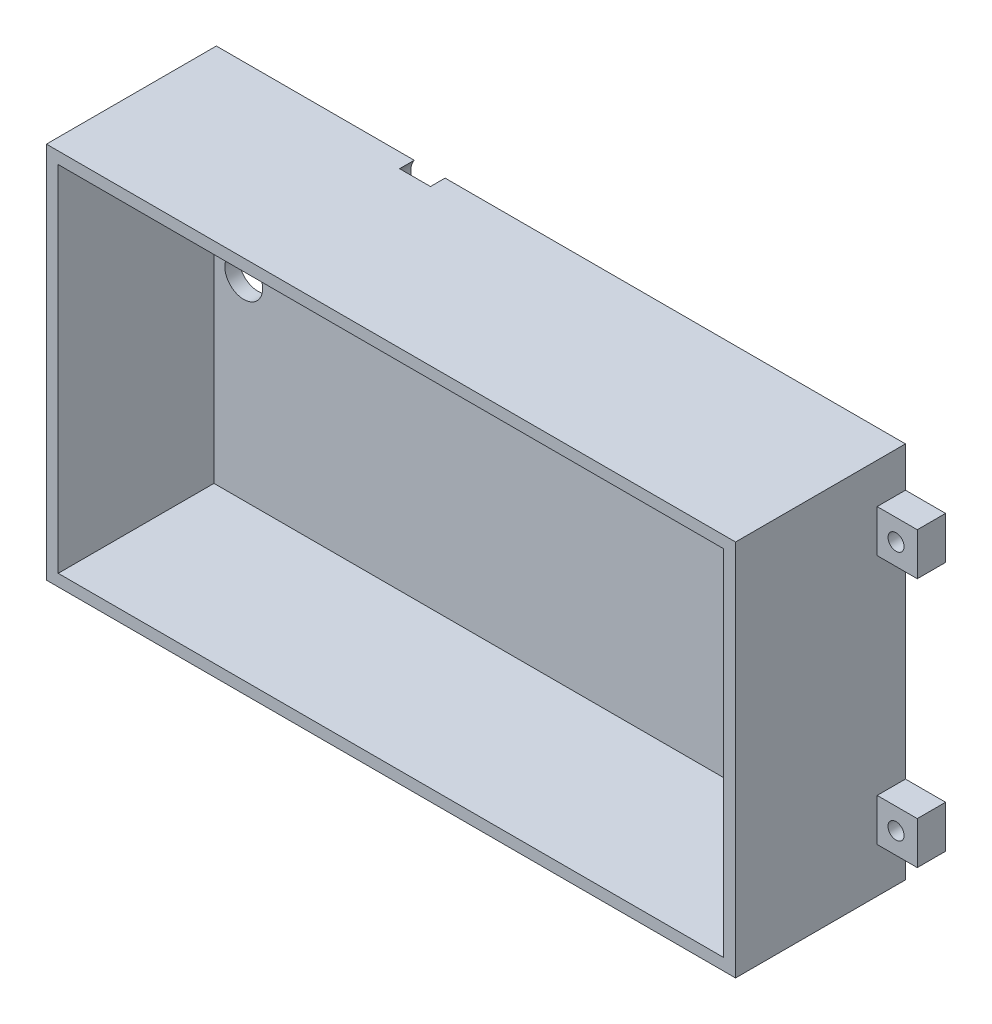
ISO-10303-21;
HEADER;
FILE_DESCRIPTION(('STEP AP214'),'2;1');
FILE_NAME('part.step','',(''),(''),'','','');
FILE_SCHEMA(('AUTOMOTIVE_DESIGN { 1 0 10303 214 1 1 1 1 }'));
ENDSEC;
DATA;
#1=APPLICATION_CONTEXT('core data for automotive mechanical design processes');
#2=APPLICATION_PROTOCOL_DEFINITION('international standard','automotive_design',2000,#1);
#3=PRODUCT_CONTEXT('',#1,'mechanical');
#4=PRODUCT('Part','Part','',(#3));
#5=PRODUCT_RELATED_PRODUCT_CATEGORY('part','',(#4));
#6=PRODUCT_DEFINITION_FORMATION('','',#4);
#7=PRODUCT_DEFINITION_CONTEXT('part definition',#1,'design');
#8=PRODUCT_DEFINITION('design','',#6,#7);
#9=PRODUCT_DEFINITION_SHAPE('','',#8);
#10=(LENGTH_UNIT() NAMED_UNIT(*) SI_UNIT(.MILLI.,.METRE.));
#11=(NAMED_UNIT(*) PLANE_ANGLE_UNIT() SI_UNIT($,.RADIAN.));
#12=(NAMED_UNIT(*) SI_UNIT($,.STERADIAN.) SOLID_ANGLE_UNIT());
#13=UNCERTAINTY_MEASURE_WITH_UNIT(LENGTH_MEASURE(1.E-05),#10,'distance_accuracy_value','');
#14=(GEOMETRIC_REPRESENTATION_CONTEXT(3) GLOBAL_UNCERTAINTY_ASSIGNED_CONTEXT((#13)) GLOBAL_UNIT_ASSIGNED_CONTEXT((#10,
#11,#12)) REPRESENTATION_CONTEXT('',''));
#15=CARTESIAN_POINT('',(0.,0.,0.));
#16=DIRECTION('',(0.,0.,1.));
#17=DIRECTION('',(1.,0.,0.));
#18=AXIS2_PLACEMENT_3D('',#15,#16,#17);
#19=CARTESIAN_POINT('',(106.75,-174.5,187.5));
#20=DIRECTION('',(0.,0.,1.));
#21=DIRECTION('',(1.,0.,0.));
#22=AXIS2_PLACEMENT_3D('',#19,#20,#21);
#23=PLANE('',#22);
#24=CARTESIAN_POINT('',(112.,-170.,187.5));
#25=DIRECTION('',(0.,0.,1.));
#26=DIRECTION('',(1.,0.,0.));
#27=AXIS2_PLACEMENT_3D('',#24,#25,#26);
#28=CIRCLE('',#27,1.7);
#29=CARTESIAN_POINT('',(113.7,-170.,187.5));
#30=VERTEX_POINT('',#29);
#31=EDGE_CURVE('E581',#30,#30,#28,.T.);
#32=ORIENTED_EDGE('',*,*,#31,.F.);
#33=EDGE_LOOP('',(#32));
#34=FACE_BOUND('',#33,.T.);
#35=DIRECTION('',(1.,0.,0.));
#36=VECTOR('',#35,1.);
#37=CARTESIAN_POINT('',(106.75,-165.5,187.5));
#38=LINE('',#37,#36);
#39=CARTESIAN_POINT('',(108.,-165.5,187.5));
#40=VERTEX_POINT('',#39);
#41=CARTESIAN_POINT('',(116.5,-165.5,187.5));
#42=VERTEX_POINT('',#41);
#43=EDGE_CURVE('E342',#40,#42,#38,.T.);
#44=ORIENTED_EDGE('',*,*,#43,.F.);
#45=DIRECTION('',(0.,-1.,0.));
#46=VECTOR('',#45,1.);
#47=CARTESIAN_POINT('',(108.,-179.25,187.5));
#48=LINE('',#47,#46);
#49=CARTESIAN_POINT('',(108.,-174.5,187.5));
#50=VERTEX_POINT('',#49);
#51=EDGE_CURVE('E457',#40,#50,#48,.T.);
#52=ORIENTED_EDGE('',*,*,#51,.T.);
#53=DIRECTION('',(1.,0.,0.));
#54=VECTOR('',#53,1.);
#55=CARTESIAN_POINT('',(106.75,-174.5,187.5));
#56=LINE('',#55,#54);
#57=CARTESIAN_POINT('',(116.5,-174.5,187.5));
#58=VERTEX_POINT('',#57);
#59=EDGE_CURVE('E351',#50,#58,#56,.T.);
#60=ORIENTED_EDGE('',*,*,#59,.T.);
#61=DIRECTION('',(0.,1.,0.));
#62=VECTOR('',#61,1.);
#63=CARTESIAN_POINT('',(116.5,-174.5,187.5));
#64=LINE('',#63,#62);
#65=EDGE_CURVE('E338',#58,#42,#64,.T.);
#66=ORIENTED_EDGE('',*,*,#65,.T.);
#67=EDGE_LOOP('',(#44,#52,#60,#66));
#68=FACE_BOUND('',#67,.T.);
#69=ADVANCED_FACE('F14',(#34,#68),#23,.T.);
#70=CARTESIAN_POINT('',(106.75,-121.5,187.5));
#71=DIRECTION('',(0.,0.,1.));
#72=DIRECTION('',(1.,0.,0.));
#73=AXIS2_PLACEMENT_3D('',#70,#71,#72);
#74=PLANE('',#73);
#75=CARTESIAN_POINT('',(112.,-117.,187.5));
#76=DIRECTION('',(0.,0.,1.));
#77=DIRECTION('',(1.,0.,0.));
#78=AXIS2_PLACEMENT_3D('',#75,#76,#77);
#79=CIRCLE('',#78,1.7);
#80=CARTESIAN_POINT('',(113.7,-117.,187.5));
#81=VERTEX_POINT('',#80);
#82=EDGE_CURVE('E332',#81,#81,#79,.T.);
#83=ORIENTED_EDGE('',*,*,#82,.F.);
#84=EDGE_LOOP('',(#83));
#85=FACE_BOUND('',#84,.T.);
#86=DIRECTION('',(1.,0.,0.));
#87=VECTOR('',#86,1.);
#88=CARTESIAN_POINT('',(106.75,-112.5,187.5));
#89=LINE('',#88,#87);
#90=CARTESIAN_POINT('',(108.,-112.5,187.5));
#91=VERTEX_POINT('',#90);
#92=CARTESIAN_POINT('',(116.5,-112.5,187.5));
#93=VERTEX_POINT('',#92);
#94=EDGE_CURVE('E281',#91,#93,#89,.T.);
#95=ORIENTED_EDGE('',*,*,#94,.F.);
#96=DIRECTION('',(0.,-1.,0.));
#97=VECTOR('',#96,1.);
#98=CARTESIAN_POINT('',(108.,-152.75,187.5));
#99=LINE('',#98,#97);
#100=CARTESIAN_POINT('',(108.,-121.5,187.5));
#101=VERTEX_POINT('',#100);
#102=EDGE_CURVE('E285',#91,#101,#99,.T.);
#103=ORIENTED_EDGE('',*,*,#102,.T.);
#104=DIRECTION('',(1.,0.,0.));
#105=VECTOR('',#104,1.);
#106=CARTESIAN_POINT('',(106.75,-121.5,187.5));
#107=LINE('',#106,#105);
#108=CARTESIAN_POINT('',(116.5,-121.5,187.5));
#109=VERTEX_POINT('',#108);
#110=EDGE_CURVE('E274',#101,#109,#107,.T.);
#111=ORIENTED_EDGE('',*,*,#110,.T.);
#112=DIRECTION('',(0.,1.,0.));
#113=VECTOR('',#112,1.);
#114=CARTESIAN_POINT('',(116.5,-121.5,187.5));
#115=LINE('',#114,#113);
#116=EDGE_CURVE('E288',#109,#93,#115,.T.);
#117=ORIENTED_EDGE('',*,*,#116,.T.);
#118=EDGE_LOOP('',(#95,#103,#111,#117));
#119=FACE_BOUND('',#118,.T.);
#120=ADVANCED_FACE('F283',(#85,#119),#74,.T.);
#121=CARTESIAN_POINT('',(-35.5,-181.5,184.5));
#122=DIRECTION('',(0.,0.,1.));
#123=DIRECTION('',(1.,0.,0.));
#124=AXIS2_PLACEMENT_3D('',#121,#122,#123);
#125=PLANE('',#124);
#126=CARTESIAN_POINT('',(-29.19341531972,-140.5927623501,184.5));
#127=DIRECTION('',(0.,0.,1.));
#128=DIRECTION('',(1.,0.,0.));
#129=AXIS2_PLACEMENT_3D('',#126,#127,#128);
#130=CIRCLE('',#129,4.);
#131=CARTESIAN_POINT('',(-25.19341531972,-140.5927623501,184.5));
#132=VERTEX_POINT('',#131);
#133=EDGE_CURVE('E439',#132,#132,#130,.T.);
#134=ORIENTED_EDGE('',*,*,#133,.F.);
#135=EDGE_LOOP('',(#134));
#136=FACE_BOUND('',#135,.T.);
#137=DIRECTION('',(1.,0.,0.));
#138=VECTOR('',#137,1.);
#139=CARTESIAN_POINT('',(-35.5,-106.5,184.5));
#140=LINE('',#139,#138);
#141=CARTESIAN_POINT('',(-35.5,-106.5,184.5));
#142=VERTEX_POINT('',#141);
#143=CARTESIAN_POINT('',(3.200133768303,-106.5,184.5));
#144=VERTEX_POINT('',#143);
#145=EDGE_CURVE('E334',#142,#144,#140,.T.);
#146=ORIENTED_EDGE('',*,*,#145,.F.);
#147=DIRECTION('',(0.,1.,0.));
#148=VECTOR('',#147,1.);
#149=CARTESIAN_POINT('',(-35.5,-181.5,184.5));
#150=LINE('',#149,#148);
#151=CARTESIAN_POINT('',(-35.5,-181.5,184.5));
#152=VERTEX_POINT('',#151);
#153=EDGE_CURVE('E9',#152,#142,#150,.T.);
#154=ORIENTED_EDGE('',*,*,#153,.F.);
#155=DIRECTION('',(1.,0.,0.));
#156=VECTOR('',#155,1.);
#157=CARTESIAN_POINT('',(-35.5,-181.5,184.5));
#158=LINE('',#157,#156);
#159=CARTESIAN_POINT('',(105.5,-181.5,184.5));
#160=VERTEX_POINT('',#159);
#161=EDGE_CURVE('E358',#152,#160,#158,.T.);
#162=ORIENTED_EDGE('',*,*,#161,.T.);
#163=DIRECTION('',(0.,1.,0.));
#164=VECTOR('',#163,1.);
#165=CARTESIAN_POINT('',(105.5,-181.5,184.5));
#166=LINE('',#165,#164);
#167=CARTESIAN_POINT('',(105.5,-106.5,184.5));
#168=VERTEX_POINT('',#167);
#169=EDGE_CURVE('E423',#160,#168,#166,.T.);
#170=ORIENTED_EDGE('',*,*,#169,.T.);
#171=DIRECTION('',(1.,0.,0.));
#172=VECTOR('',#171,1.);
#173=CARTESIAN_POINT('',(-35.5,-106.5,184.5));
#174=LINE('',#173,#172);
#175=CARTESIAN_POINT('',(11.190311357962,-106.5,184.5));
#176=VERTEX_POINT('',#175);
#177=EDGE_CURVE('E24',#176,#168,#174,.T.);
#178=ORIENTED_EDGE('',*,*,#177,.F.);
#179=CARTESIAN_POINT('',(7.195222563132,-106.3018447037,184.5));
#180=DIRECTION('',(0.,0.,1.));
#181=DIRECTION('',(1.,0.,0.));
#182=AXIS2_PLACEMENT_3D('',#179,#180,#181);
#183=CIRCLE('',#182,4.);
#184=EDGE_CURVE('E411',#144,#176,#183,.T.);
#185=ORIENTED_EDGE('',*,*,#184,.F.);
#186=EDGE_LOOP('',(#146,#154,#162,#170,#178,#185));
#187=FACE_BOUND('',#186,.T.);
#188=ADVANCED_FACE('F755',(#136,#187),#125,.T.);
#189=CARTESIAN_POINT('',(-35.5,-181.5,184.5));
#190=DIRECTION('',(1.,0.,0.));
#191=DIRECTION('',(0.,1.,0.));
#192=AXIS2_PLACEMENT_3D('',#189,#190,#191);
#193=PLANE('',#192);
#194=DIRECTION('',(0.,0.,1.));
#195=VECTOR('',#194,1.);
#196=CARTESIAN_POINT('',(-35.5,-181.5,184.5));
#197=LINE('',#196,#195);
#198=CARTESIAN_POINT('',(-35.5,-181.5,217.5));
#199=VERTEX_POINT('',#198);
#200=EDGE_CURVE('E362',#152,#199,#197,.T.);
#201=ORIENTED_EDGE('',*,*,#200,.F.);
#202=ORIENTED_EDGE('',*,*,#153,.T.);
#203=DIRECTION('',(0.,0.,1.));
#204=VECTOR('',#203,1.);
#205=CARTESIAN_POINT('',(-35.5,-106.5,184.5));
#206=LINE('',#205,#204);
#207=CARTESIAN_POINT('',(-35.5,-106.5,217.5));
#208=VERTEX_POINT('',#207);
#209=EDGE_CURVE('E337',#142,#208,#206,.T.);
#210=ORIENTED_EDGE('',*,*,#209,.T.);
#211=DIRECTION('',(0.,1.,0.));
#212=VECTOR('',#211,1.);
#213=CARTESIAN_POINT('',(-35.5,-182.75,217.5));
#214=LINE('',#213,#212);
#215=EDGE_CURVE('E428',#199,#208,#214,.T.);
#216=ORIENTED_EDGE('',*,*,#215,.F.);
#217=EDGE_LOOP('',(#201,#202,#210,#216));
#218=FACE_BOUND('',#217,.T.);
#219=ADVANCED_FACE('F790',(#218),#193,.T.);
#220=CARTESIAN_POINT('',(-35.5,-106.5,184.5));
#221=DIRECTION('',(0.,1.,0.));
#222=DIRECTION('',(1.,0.,0.));
#223=AXIS2_PLACEMENT_3D('',#220,#221,#222);
#224=PLANE('',#223);
#225=DIRECTION('',(-1.,0.,0.));
#226=VECTOR('',#225,1.);
#227=CARTESIAN_POINT('',(-36.75,-106.5,217.5));
#228=LINE('',#227,#226);
#229=CARTESIAN_POINT('',(105.5,-106.5,217.5));
#230=VERTEX_POINT('',#229);
#231=EDGE_CURVE('E432',#230,#208,#228,.T.);
#232=ORIENTED_EDGE('',*,*,#231,.T.);
#233=ORIENTED_EDGE('',*,*,#209,.F.);
#234=ORIENTED_EDGE('',*,*,#145,.T.);
#235=DIRECTION('',(0.,0.,1.));
#236=VECTOR('',#235,1.);
#237=CARTESIAN_POINT('',(3.200133768304,-106.5,181.4));
#238=LINE('',#237,#236);
#239=CARTESIAN_POINT('',(3.200133768304,-106.5,184.6));
#240=VERTEX_POINT('',#239);
#241=EDGE_CURVE('E416',#144,#240,#238,.T.);
#242=ORIENTED_EDGE('',*,*,#241,.T.);
#243=DIRECTION('',(1.,0.,0.));
#244=VECTOR('',#243,1.);
#245=CARTESIAN_POINT('',(-14.15238871843,-106.5,184.6));
#246=LINE('',#245,#244);
#247=CARTESIAN_POINT('',(11.190311357961,-106.5,184.6));
#248=VERTEX_POINT('',#247);
#249=EDGE_CURVE('E485',#240,#248,#246,.T.);
#250=ORIENTED_EDGE('',*,*,#249,.T.);
#251=DIRECTION('',(0.,0.,1.));
#252=VECTOR('',#251,1.);
#253=CARTESIAN_POINT('',(11.190311357961,-106.5,181.4));
#254=LINE('',#253,#252);
#255=EDGE_CURVE('E415',#176,#248,#254,.T.);
#256=ORIENTED_EDGE('',*,*,#255,.F.);
#257=ORIENTED_EDGE('',*,*,#177,.T.);
#258=DIRECTION('',(0.,0.,1.));
#259=VECTOR('',#258,1.);
#260=CARTESIAN_POINT('',(105.5,-106.5,184.5));
#261=LINE('',#260,#259);
#262=EDGE_CURVE('E427',#168,#230,#261,.T.);
#263=ORIENTED_EDGE('',*,*,#262,.T.);
#264=EDGE_LOOP('',(#232,#233,#234,#242,#250,#256,#257,#263));
#265=FACE_BOUND('',#264,.T.);
#266=ADVANCED_FACE('F792',(#265),#224,.F.);
#267=CARTESIAN_POINT('',(105.5,-181.5,184.5));
#268=DIRECTION('',(1.,0.,0.));
#269=DIRECTION('',(0.,1.,0.));
#270=AXIS2_PLACEMENT_3D('',#267,#268,#269);
#271=PLANE('',#270);
#272=DIRECTION('',(0.,1.,0.));
#273=VECTOR('',#272,1.);
#274=CARTESIAN_POINT('',(105.5,-182.75,217.5));
#275=LINE('',#274,#273);
#276=CARTESIAN_POINT('',(105.5,-181.5,217.5));
#277=VERTEX_POINT('',#276);
#278=EDGE_CURVE('E535',#277,#230,#275,.T.);
#279=ORIENTED_EDGE('',*,*,#278,.T.);
#280=ORIENTED_EDGE('',*,*,#262,.F.);
#281=ORIENTED_EDGE('',*,*,#169,.F.);
#282=DIRECTION('',(0.,0.,1.));
#283=VECTOR('',#282,1.);
#284=CARTESIAN_POINT('',(105.5,-181.5,184.5));
#285=LINE('',#284,#283);
#286=EDGE_CURVE('E363',#160,#277,#285,.T.);
#287=ORIENTED_EDGE('',*,*,#286,.T.);
#288=EDGE_LOOP('',(#279,#280,#281,#287));
#289=FACE_BOUND('',#288,.T.);
#290=ADVANCED_FACE('F846',(#289),#271,.F.);
#291=CARTESIAN_POINT('',(-35.5,-181.5,184.5));
#292=DIRECTION('',(0.,1.,0.));
#293=DIRECTION('',(1.,0.,0.));
#294=AXIS2_PLACEMENT_3D('',#291,#292,#293);
#295=PLANE('',#294);
#296=ORIENTED_EDGE('',*,*,#286,.F.);
#297=ORIENTED_EDGE('',*,*,#161,.F.);
#298=ORIENTED_EDGE('',*,*,#200,.T.);
#299=DIRECTION('',(-1.,0.,0.));
#300=VECTOR('',#299,1.);
#301=CARTESIAN_POINT('',(-36.75,-181.5,217.5));
#302=LINE('',#301,#300);
#303=EDGE_CURVE('E433',#277,#199,#302,.T.);
#304=ORIENTED_EDGE('',*,*,#303,.F.);
#305=EDGE_LOOP('',(#296,#297,#298,#304));
#306=FACE_BOUND('',#305,.T.);
#307=ADVANCED_FACE('F782',(#306),#295,.T.);
#308=CARTESIAN_POINT('',(112.,-117.,181.3));
#309=DIRECTION('',(0.,0.,1.));
#310=DIRECTION('',(1.,0.,0.));
#311=AXIS2_PLACEMENT_3D('',#308,#309,#310);
#312=CYLINDRICAL_SURFACE('',#311,1.7);
#313=DIRECTION('',(0.,0.,1.));
#314=VECTOR('',#313,1.);
#315=CARTESIAN_POINT('',(113.7,-117.,181.3));
#316=LINE('',#315,#314);
#317=CARTESIAN_POINT('',(113.7,-117.,181.5));
#318=VERTEX_POINT('',#317);
#319=EDGE_CURVE('E328',#318,#81,#316,.T.);
#320=ORIENTED_EDGE('',*,*,#319,.F.);
#321=CARTESIAN_POINT('',(112.,-117.,181.5));
#322=DIRECTION('',(0.,0.,1.));
#323=DIRECTION('',(1.,0.,0.));
#324=AXIS2_PLACEMENT_3D('',#321,#322,#323);
#325=CIRCLE('',#324,1.7);
#326=EDGE_CURVE('E466',#318,#318,#325,.T.);
#327=ORIENTED_EDGE('',*,*,#326,.F.);
#328=ORIENTED_EDGE('',*,*,#319,.T.);
#329=ORIENTED_EDGE('',*,*,#82,.T.);
#330=EDGE_LOOP('',(#320,#327,#328,#329));
#331=FACE_BOUND('',#330,.T.);
#332=ADVANCED_FACE('F778',(#331),#312,.F.);
#333=CARTESIAN_POINT('',(-42.,-117.,181.3));
#334=DIRECTION('',(0.,0.,1.));
#335=DIRECTION('',(1.,0.,0.));
#336=AXIS2_PLACEMENT_3D('',#333,#334,#335);
#337=CYLINDRICAL_SURFACE('',#336,1.7);
#338=DIRECTION('',(0.,0.,1.));
#339=VECTOR('',#338,1.);
#340=CARTESIAN_POINT('',(-40.3,-117.,181.3));
#341=LINE('',#340,#339);
#342=CARTESIAN_POINT('',(-40.3,-117.,181.5));
#343=VERTEX_POINT('',#342);
#344=CARTESIAN_POINT('',(-40.3,-117.,187.5));
#345=VERTEX_POINT('',#344);
#346=EDGE_CURVE('E333',#343,#345,#341,.T.);
#347=ORIENTED_EDGE('',*,*,#346,.F.);
#348=CARTESIAN_POINT('',(-42.,-117.,181.5));
#349=DIRECTION('',(0.,0.,1.));
#350=DIRECTION('',(1.,0.,0.));
#351=AXIS2_PLACEMENT_3D('',#348,#349,#350);
#352=CIRCLE('',#351,1.7);
#353=EDGE_CURVE('E471',#343,#343,#352,.T.);
#354=ORIENTED_EDGE('',*,*,#353,.F.);
#355=ORIENTED_EDGE('',*,*,#346,.T.);
#356=CARTESIAN_POINT('',(-42.,-117.,187.5));
#357=DIRECTION('',(0.,0.,1.));
#358=DIRECTION('',(1.,0.,0.));
#359=AXIS2_PLACEMENT_3D('',#356,#357,#358);
#360=CIRCLE('',#359,1.7);
#361=EDGE_CURVE('E381',#345,#345,#360,.T.);
#362=ORIENTED_EDGE('',*,*,#361,.T.);
#363=EDGE_LOOP('',(#347,#354,#355,#362));
#364=FACE_BOUND('',#363,.T.);
#365=ADVANCED_FACE('F781',(#364),#337,.F.);
#366=CARTESIAN_POINT('',(-29.19341531972,-140.5927623501,181.4));
#367=DIRECTION('',(0.,0.,1.));
#368=DIRECTION('',(1.,0.,0.));
#369=AXIS2_PLACEMENT_3D('',#366,#367,#368);
#370=CYLINDRICAL_SURFACE('',#369,4.);
#371=DIRECTION('',(0.,0.,1.));
#372=VECTOR('',#371,1.);
#373=CARTESIAN_POINT('',(-25.19341531972,-140.5927623501,181.4));
#374=LINE('',#373,#372);
#375=CARTESIAN_POINT('',(-25.19341531972,-140.5927623501,181.5));
#376=VERTEX_POINT('',#375);
#377=EDGE_CURVE('E442',#376,#132,#374,.T.);
#378=ORIENTED_EDGE('',*,*,#377,.F.);
#379=CARTESIAN_POINT('',(-29.19341531972,-140.5927623501,181.5));
#380=DIRECTION('',(0.,0.,1.));
#381=DIRECTION('',(1.,0.,0.));
#382=AXIS2_PLACEMENT_3D('',#379,#380,#381);
#383=CIRCLE('',#382,4.);
#384=EDGE_CURVE('E373',#376,#376,#383,.T.);
#385=ORIENTED_EDGE('',*,*,#384,.F.);
#386=ORIENTED_EDGE('',*,*,#377,.T.);
#387=ORIENTED_EDGE('',*,*,#133,.T.);
#388=EDGE_LOOP('',(#378,#385,#386,#387));
#389=FACE_BOUND('',#388,.T.);
#390=ADVANCED_FACE('F762',(#389),#370,.F.);
#391=CARTESIAN_POINT('',(112.,-170.,181.3));
#392=DIRECTION('',(0.,0.,1.));
#393=DIRECTION('',(1.,0.,0.));
#394=AXIS2_PLACEMENT_3D('',#391,#392,#393);
#395=CYLINDRICAL_SURFACE('',#394,1.7);
#396=DIRECTION('',(0.,0.,1.));
#397=VECTOR('',#396,1.);
#398=CARTESIAN_POINT('',(113.7,-170.,181.3));
#399=LINE('',#398,#397);
#400=CARTESIAN_POINT('',(113.7,-170.,181.5));
#401=VERTEX_POINT('',#400);
#402=EDGE_CURVE('E488',#401,#30,#399,.T.);
#403=ORIENTED_EDGE('',*,*,#402,.F.);
#404=CARTESIAN_POINT('',(112.,-170.,181.5));
#405=DIRECTION('',(0.,0.,1.));
#406=DIRECTION('',(1.,0.,0.));
#407=AXIS2_PLACEMENT_3D('',#404,#405,#406);
#408=CIRCLE('',#407,1.7);
#409=EDGE_CURVE('E369',#401,#401,#408,.T.);
#410=ORIENTED_EDGE('',*,*,#409,.F.);
#411=ORIENTED_EDGE('',*,*,#402,.T.);
#412=ORIENTED_EDGE('',*,*,#31,.T.);
#413=EDGE_LOOP('',(#403,#410,#411,#412));
#414=FACE_BOUND('',#413,.T.);
#415=ADVANCED_FACE('F788',(#414),#395,.F.);
#416=CARTESIAN_POINT('',(-42.,-171.5,181.3));
#417=DIRECTION('',(0.,0.,1.));
#418=DIRECTION('',(1.,0.,0.));
#419=AXIS2_PLACEMENT_3D('',#416,#417,#418);
#420=CYLINDRICAL_SURFACE('',#419,1.7);
#421=DIRECTION('',(0.,0.,1.));
#422=VECTOR('',#421,1.);
#423=CARTESIAN_POINT('',(-40.3,-171.5,181.3));
#424=LINE('',#423,#422);
#425=CARTESIAN_POINT('',(-40.3,-171.5,181.5));
#426=VERTEX_POINT('',#425);
#427=CARTESIAN_POINT('',(-40.3,-171.5,187.5));
#428=VERTEX_POINT('',#427);
#429=EDGE_CURVE('E292',#426,#428,#424,.T.);
#430=ORIENTED_EDGE('',*,*,#429,.F.);
#431=CARTESIAN_POINT('',(-42.,-171.5,181.5));
#432=DIRECTION('',(0.,0.,1.));
#433=DIRECTION('',(1.,0.,0.));
#434=AXIS2_PLACEMENT_3D('',#431,#432,#433);
#435=CIRCLE('',#434,1.7);
#436=EDGE_CURVE('E374',#426,#426,#435,.T.);
#437=ORIENTED_EDGE('',*,*,#436,.F.);
#438=ORIENTED_EDGE('',*,*,#429,.T.);
#439=CARTESIAN_POINT('',(-42.,-171.5,187.5));
#440=DIRECTION('',(0.,0.,1.));
#441=DIRECTION('',(1.,0.,0.));
#442=AXIS2_PLACEMENT_3D('',#439,#440,#441);
#443=CIRCLE('',#442,1.7);
#444=EDGE_CURVE('E406',#428,#428,#443,.T.);
#445=ORIENTED_EDGE('',*,*,#444,.T.);
#446=EDGE_LOOP('',(#430,#437,#438,#445));
#447=FACE_BOUND('',#446,.T.);
#448=ADVANCED_FACE('F777',(#447),#420,.F.);
#449=CARTESIAN_POINT('',(106.75,-112.5,181.5));
#450=DIRECTION('',(0.,1.,0.));
#451=DIRECTION('',(1.,0.,0.));
#452=AXIS2_PLACEMENT_3D('',#449,#450,#451);
#453=PLANE('',#452);
#454=DIRECTION('',(1.,0.,0.));
#455=VECTOR('',#454,1.);
#456=CARTESIAN_POINT('',(106.75,-112.5,181.5));
#457=LINE('',#456,#455);
#458=CARTESIAN_POINT('',(108.,-112.5,181.5));
#459=VERTEX_POINT('',#458);
#460=CARTESIAN_POINT('',(116.5,-112.5,181.5));
#461=VERTEX_POINT('',#460);
#462=EDGE_CURVE('E298',#459,#461,#457,.T.);
#463=ORIENTED_EDGE('',*,*,#462,.F.);
#464=DIRECTION('',(0.,0.,1.));
#465=VECTOR('',#464,1.);
#466=CARTESIAN_POINT('',(108.,-112.5,181.5));
#467=LINE('',#466,#465);
#468=EDGE_CURVE('E295',#459,#91,#467,.T.);
#469=ORIENTED_EDGE('',*,*,#468,.T.);
#470=ORIENTED_EDGE('',*,*,#94,.T.);
#471=DIRECTION('',(0.,0.,1.));
#472=VECTOR('',#471,1.);
#473=CARTESIAN_POINT('',(116.5,-112.5,181.5));
#474=LINE('',#473,#472);
#475=EDGE_CURVE('E321',#461,#93,#474,.T.);
#476=ORIENTED_EDGE('',*,*,#475,.F.);
#477=EDGE_LOOP('',(#463,#469,#470,#476));
#478=FACE_BOUND('',#477,.T.);
#479=ADVANCED_FACE('F296',(#478),#453,.T.);
#480=CARTESIAN_POINT('',(116.5,-121.5,181.5));
#481=DIRECTION('',(1.,0.,0.));
#482=DIRECTION('',(0.,1.,0.));
#483=AXIS2_PLACEMENT_3D('',#480,#481,#482);
#484=PLANE('',#483);
#485=DIRECTION('',(0.,0.,1.));
#486=VECTOR('',#485,1.);
#487=CARTESIAN_POINT('',(116.5,-121.5,181.5));
#488=LINE('',#487,#486);
#489=CARTESIAN_POINT('',(116.5,-121.5,181.5));
#490=VERTEX_POINT('',#489);
#491=EDGE_CURVE('E546',#490,#109,#488,.T.);
#492=ORIENTED_EDGE('',*,*,#491,.F.);
#493=DIRECTION('',(0.,1.,0.));
#494=VECTOR('',#493,1.);
#495=CARTESIAN_POINT('',(116.5,-121.5,181.5));
#496=LINE('',#495,#494);
#497=EDGE_CURVE('E364',#490,#461,#496,.T.);
#498=ORIENTED_EDGE('',*,*,#497,.T.);
#499=ORIENTED_EDGE('',*,*,#475,.T.);
#500=ORIENTED_EDGE('',*,*,#116,.F.);
#501=EDGE_LOOP('',(#492,#498,#499,#500));
#502=FACE_BOUND('',#501,.T.);
#503=ADVANCED_FACE('F745',(#502),#484,.T.);
#504=CARTESIAN_POINT('',(106.75,-121.5,181.5));
#505=DIRECTION('',(0.,1.,0.));
#506=DIRECTION('',(1.,0.,0.));
#507=AXIS2_PLACEMENT_3D('',#504,#505,#506);
#508=PLANE('',#507);
#509=ORIENTED_EDGE('',*,*,#491,.T.);
#510=ORIENTED_EDGE('',*,*,#110,.F.);
#511=DIRECTION('',(0.,0.,1.));
#512=VECTOR('',#511,1.);
#513=CARTESIAN_POINT('',(108.,-121.5,181.5));
#514=LINE('',#513,#512);
#515=CARTESIAN_POINT('',(108.,-121.5,181.5));
#516=VERTEX_POINT('',#515);
#517=EDGE_CURVE('E307',#516,#101,#514,.T.);
#518=ORIENTED_EDGE('',*,*,#517,.F.);
#519=DIRECTION('',(1.,0.,0.));
#520=VECTOR('',#519,1.);
#521=CARTESIAN_POINT('',(106.75,-121.5,181.5));
#522=LINE('',#521,#520);
#523=EDGE_CURVE('E368',#516,#490,#522,.T.);
#524=ORIENTED_EDGE('',*,*,#523,.T.);
#525=EDGE_LOOP('',(#509,#510,#518,#524));
#526=FACE_BOUND('',#525,.T.);
#527=ADVANCED_FACE('F736',(#526),#508,.F.);
#528=CARTESIAN_POINT('',(-46.5,-121.5,181.5));
#529=DIRECTION('',(1.,0.,0.));
#530=DIRECTION('',(0.,1.,0.));
#531=AXIS2_PLACEMENT_3D('',#528,#529,#530);
#532=PLANE('',#531);
#533=DIRECTION('',(0.,1.,0.));
#534=VECTOR('',#533,1.);
#535=CARTESIAN_POINT('',(-46.5,-121.5,187.5));
#536=LINE('',#535,#534);
#537=CARTESIAN_POINT('',(-46.5,-121.5,187.5));
#538=VERTEX_POINT('',#537);
#539=CARTESIAN_POINT('',(-46.5,-112.5,187.5));
#540=VERTEX_POINT('',#539);
#541=EDGE_CURVE('E502',#538,#540,#536,.T.);
#542=ORIENTED_EDGE('',*,*,#541,.T.);
#543=DIRECTION('',(0.,0.,1.));
#544=VECTOR('',#543,1.);
#545=CARTESIAN_POINT('',(-46.5,-112.5,181.5));
#546=LINE('',#545,#544);
#547=CARTESIAN_POINT('',(-46.5,-112.5,181.5));
#548=VERTEX_POINT('',#547);
#549=EDGE_CURVE('E470',#548,#540,#546,.T.);
#550=ORIENTED_EDGE('',*,*,#549,.F.);
#551=DIRECTION('',(0.,1.,0.));
#552=VECTOR('',#551,1.);
#553=CARTESIAN_POINT('',(-46.5,-121.5,181.5));
#554=LINE('',#553,#552);
#555=CARTESIAN_POINT('',(-46.5,-121.5,181.5));
#556=VERTEX_POINT('',#555);
#557=EDGE_CURVE('E318',#556,#548,#554,.T.);
#558=ORIENTED_EDGE('',*,*,#557,.F.);
#559=DIRECTION('',(0.,0.,1.));
#560=VECTOR('',#559,1.);
#561=CARTESIAN_POINT('',(-46.5,-121.5,181.5));
#562=LINE('',#561,#560);
#563=EDGE_CURVE('E385',#556,#538,#562,.T.);
#564=ORIENTED_EDGE('',*,*,#563,.T.);
#565=EDGE_LOOP('',(#542,#550,#558,#564));
#566=FACE_BOUND('',#565,.T.);
#567=ADVANCED_FACE('F730',(#566),#532,.F.);
#568=CARTESIAN_POINT('',(106.75,-165.5,181.5));
#569=DIRECTION('',(0.,1.,0.));
#570=DIRECTION('',(1.,0.,0.));
#571=AXIS2_PLACEMENT_3D('',#568,#569,#570);
#572=PLANE('',#571);
#573=DIRECTION('',(1.,0.,0.));
#574=VECTOR('',#573,1.);
#575=CARTESIAN_POINT('',(106.75,-165.5,181.5));
#576=LINE('',#575,#574);
#577=CARTESIAN_POINT('',(108.,-165.5,181.5));
#578=VERTEX_POINT('',#577);
#579=CARTESIAN_POINT('',(116.5,-165.5,181.5));
#580=VERTEX_POINT('',#579);
#581=EDGE_CURVE('E422',#578,#580,#576,.T.);
#582=ORIENTED_EDGE('',*,*,#581,.F.);
#583=DIRECTION('',(0.,0.,1.));
#584=VECTOR('',#583,1.);
#585=CARTESIAN_POINT('',(108.,-165.5,181.5));
#586=LINE('',#585,#584);
#587=EDGE_CURVE('E314',#578,#40,#586,.T.);
#588=ORIENTED_EDGE('',*,*,#587,.T.);
#589=ORIENTED_EDGE('',*,*,#43,.T.);
#590=DIRECTION('',(0.,0.,1.));
#591=VECTOR('',#590,1.);
#592=CARTESIAN_POINT('',(116.5,-165.5,181.5));
#593=LINE('',#592,#591);
#594=EDGE_CURVE('E343',#580,#42,#593,.T.);
#595=ORIENTED_EDGE('',*,*,#594,.F.);
#596=EDGE_LOOP('',(#582,#588,#589,#595));
#597=FACE_BOUND('',#596,.T.);
#598=ADVANCED_FACE('F735',(#597),#572,.T.);
#599=CARTESIAN_POINT('',(116.5,-174.5,181.5));
#600=DIRECTION('',(1.,0.,0.));
#601=DIRECTION('',(0.,1.,0.));
#602=AXIS2_PLACEMENT_3D('',#599,#600,#601);
#603=PLANE('',#602);
#604=DIRECTION('',(0.,0.,1.));
#605=VECTOR('',#604,1.);
#606=CARTESIAN_POINT('',(116.5,-174.5,181.5));
#607=LINE('',#606,#605);
#608=CARTESIAN_POINT('',(116.5,-174.5,181.5));
#609=VERTEX_POINT('',#608);
#610=EDGE_CURVE('E302',#609,#58,#607,.T.);
#611=ORIENTED_EDGE('',*,*,#610,.F.);
#612=DIRECTION('',(0.,1.,0.));
#613=VECTOR('',#612,1.);
#614=CARTESIAN_POINT('',(116.5,-174.5,181.5));
#615=LINE('',#614,#613);
#616=EDGE_CURVE('E417',#609,#580,#615,.T.);
#617=ORIENTED_EDGE('',*,*,#616,.T.);
#618=ORIENTED_EDGE('',*,*,#594,.T.);
#619=ORIENTED_EDGE('',*,*,#65,.F.);
#620=EDGE_LOOP('',(#611,#617,#618,#619));
#621=FACE_BOUND('',#620,.T.);
#622=ADVANCED_FACE('F743',(#621),#603,.T.);
#623=CARTESIAN_POINT('',(106.75,-174.5,181.5));
#624=DIRECTION('',(0.,1.,0.));
#625=DIRECTION('',(1.,0.,0.));
#626=AXIS2_PLACEMENT_3D('',#623,#624,#625);
#627=PLANE('',#626);
#628=ORIENTED_EDGE('',*,*,#610,.T.);
#629=ORIENTED_EDGE('',*,*,#59,.F.);
#630=DIRECTION('',(0.,0.,1.));
#631=VECTOR('',#630,1.);
#632=CARTESIAN_POINT('',(108.,-174.5,181.5));
#633=LINE('',#632,#631);
#634=CARTESIAN_POINT('',(108.,-174.5,181.5));
#635=VERTEX_POINT('',#634);
#636=EDGE_CURVE('E497',#635,#50,#633,.T.);
#637=ORIENTED_EDGE('',*,*,#636,.F.);
#638=DIRECTION('',(1.,0.,0.));
#639=VECTOR('',#638,1.);
#640=CARTESIAN_POINT('',(106.75,-174.5,181.5));
#641=LINE('',#640,#639);
#642=EDGE_CURVE('E421',#635,#609,#641,.T.);
#643=ORIENTED_EDGE('',*,*,#642,.T.);
#644=EDGE_LOOP('',(#628,#629,#637,#643));
#645=FACE_BOUND('',#644,.T.);
#646=ADVANCED_FACE('F856',(#645),#627,.F.);
#647=CARTESIAN_POINT('',(-46.5,-176.,181.5));
#648=DIRECTION('',(1.,0.,0.));
#649=DIRECTION('',(0.,1.,0.));
#650=AXIS2_PLACEMENT_3D('',#647,#648,#649);
#651=PLANE('',#650);
#652=DIRECTION('',(0.,1.,0.));
#653=VECTOR('',#652,1.);
#654=CARTESIAN_POINT('',(-46.5,-176.,187.5));
#655=LINE('',#654,#653);
#656=CARTESIAN_POINT('',(-46.5,-176.,187.5));
#657=VERTEX_POINT('',#656);
#658=CARTESIAN_POINT('',(-46.5,-167.,187.5));
#659=VERTEX_POINT('',#658);
#660=EDGE_CURVE('E352',#657,#659,#655,.T.);
#661=ORIENTED_EDGE('',*,*,#660,.T.);
#662=DIRECTION('',(0.,0.,1.));
#663=VECTOR('',#662,1.);
#664=CARTESIAN_POINT('',(-46.5,-167.,181.5));
#665=LINE('',#664,#663);
#666=CARTESIAN_POINT('',(-46.5,-167.,181.5));
#667=VERTEX_POINT('',#666);
#668=EDGE_CURVE('E590',#667,#659,#665,.T.);
#669=ORIENTED_EDGE('',*,*,#668,.F.);
#670=DIRECTION('',(0.,1.,0.));
#671=VECTOR('',#670,1.);
#672=CARTESIAN_POINT('',(-46.5,-176.,181.5));
#673=LINE('',#672,#671);
#674=CARTESIAN_POINT('',(-46.5,-176.,181.5));
#675=VERTEX_POINT('',#674);
#676=EDGE_CURVE('E395',#675,#667,#673,.T.);
#677=ORIENTED_EDGE('',*,*,#676,.F.);
#678=DIRECTION('',(0.,0.,1.));
#679=VECTOR('',#678,1.);
#680=CARTESIAN_POINT('',(-46.5,-176.,181.5));
#681=LINE('',#680,#679);
#682=EDGE_CURVE('E410',#675,#657,#681,.T.);
#683=ORIENTED_EDGE('',*,*,#682,.T.);
#684=EDGE_LOOP('',(#661,#669,#677,#683));
#685=FACE_BOUND('',#684,.T.);
#686=ADVANCED_FACE('F858',(#685),#651,.F.);
#687=CARTESIAN_POINT('',(108.,-184.,181.5));
#688=DIRECTION('',(1.,0.,0.));
#689=DIRECTION('',(0.,1.,0.));
#690=AXIS2_PLACEMENT_3D('',#687,#688,#689);
#691=PLANE('',#690);
#692=DIRECTION('',(0.,0.,1.));
#693=VECTOR('',#692,1.);
#694=CARTESIAN_POINT('',(108.,-104.,181.5));
#695=LINE('',#694,#693);
#696=CARTESIAN_POINT('',(108.,-104.,181.5));
#697=VERTEX_POINT('',#696);
#698=CARTESIAN_POINT('',(108.,-104.,217.5));
#699=VERTEX_POINT('',#698);
#700=EDGE_CURVE('E512',#697,#699,#695,.T.);
#701=ORIENTED_EDGE('',*,*,#700,.T.);
#702=DIRECTION('',(0.,1.,0.));
#703=VECTOR('',#702,1.);
#704=CARTESIAN_POINT('',(108.,-184.,217.5));
#705=LINE('',#704,#703);
#706=CARTESIAN_POINT('',(108.,-184.,217.5));
#707=VERTEX_POINT('',#706);
#708=EDGE_CURVE('E379',#707,#699,#705,.T.);
#709=ORIENTED_EDGE('',*,*,#708,.F.);
#710=DIRECTION('',(0.,0.,1.));
#711=VECTOR('',#710,1.);
#712=CARTESIAN_POINT('',(108.,-184.,181.5));
#713=LINE('',#712,#711);
#714=CARTESIAN_POINT('',(108.,-184.,181.5));
#715=VERTEX_POINT('',#714);
#716=EDGE_CURVE('E380',#715,#707,#713,.T.);
#717=ORIENTED_EDGE('',*,*,#716,.F.);
#718=DIRECTION('',(0.,1.,0.));
#719=VECTOR('',#718,1.);
#720=CARTESIAN_POINT('',(108.,-184.,181.5));
#721=LINE('',#720,#719);
#722=EDGE_CURVE('E438',#715,#635,#721,.T.);
#723=ORIENTED_EDGE('',*,*,#722,.T.);
#724=ORIENTED_EDGE('',*,*,#636,.T.);
#725=ORIENTED_EDGE('',*,*,#51,.F.);
#726=ORIENTED_EDGE('',*,*,#587,.F.);
#727=DIRECTION('',(0.,1.,0.));
#728=VECTOR('',#727,1.);
#729=CARTESIAN_POINT('',(108.,-184.,181.5));
#730=LINE('',#729,#728);
#731=EDGE_CURVE('E492',#578,#516,#730,.T.);
#732=ORIENTED_EDGE('',*,*,#731,.T.);
#733=ORIENTED_EDGE('',*,*,#517,.T.);
#734=ORIENTED_EDGE('',*,*,#102,.F.);
#735=ORIENTED_EDGE('',*,*,#468,.F.);
#736=DIRECTION('',(0.,1.,0.));
#737=VECTOR('',#736,1.);
#738=CARTESIAN_POINT('',(108.,-184.,181.5));
#739=LINE('',#738,#737);
#740=EDGE_CURVE('E449',#459,#697,#739,.T.);
#741=ORIENTED_EDGE('',*,*,#740,.T.);
#742=EDGE_LOOP('',(#701,#709,#717,#723,#724,#725,#726,#732,#733,#734,#735,#741));
#743=FACE_BOUND('',#742,.T.);
#744=ADVANCED_FACE('F305',(#743),#691,.T.);
#745=CARTESIAN_POINT('',(7.195222563132,-106.3018447037,184.6));
#746=DIRECTION('',(0.,0.,1.));
#747=DIRECTION('',(1.,0.,0.));
#748=AXIS2_PLACEMENT_3D('',#745,#746,#747);
#749=PLANE('',#748);
#750=ORIENTED_EDGE('',*,*,#249,.F.);
#751=CARTESIAN_POINT('',(7.195222563132,-106.3018447037,184.6));
#752=DIRECTION('',(0.,0.,1.));
#753=DIRECTION('',(1.,0.,0.));
#754=AXIS2_PLACEMENT_3D('',#751,#752,#753);
#755=CIRCLE('',#754,4.);
#756=CARTESIAN_POINT('',(3.923906167574,-104.,184.6));
#757=VERTEX_POINT('',#756);
#758=EDGE_CURVE('E531',#757,#240,#755,.T.);
#759=ORIENTED_EDGE('',*,*,#758,.F.);
#760=DIRECTION('',(1.,0.,0.));
#761=VECTOR('',#760,1.);
#762=CARTESIAN_POINT('',(-15.40238871843,-104.,184.6));
#763=LINE('',#762,#761);
#764=CARTESIAN_POINT('',(10.466538958691,-104.,184.6));
#765=VERTEX_POINT('',#764);
#766=EDGE_CURVE('E476',#757,#765,#763,.T.);
#767=ORIENTED_EDGE('',*,*,#766,.T.);
#768=CARTESIAN_POINT('',(7.195222563132,-106.3018447037,184.6));
#769=DIRECTION('',(0.,0.,1.));
#770=DIRECTION('',(0.998772198707162,-0.0495388240641681,0.));
#771=AXIS2_PLACEMENT_3D('',#768,#769,#770);
#772=CIRCLE('',#771,4.);
#773=EDGE_CURVE('E461',#248,#765,#772,.T.);
#774=ORIENTED_EDGE('',*,*,#773,.F.);
#775=EDGE_LOOP('',(#750,#759,#767,#774));
#776=FACE_BOUND('',#775,.T.);
#777=ADVANCED_FACE('F674',(#776),#749,.F.);
#778=CARTESIAN_POINT('',(7.195222563132,-106.3018447037,181.4));
#779=DIRECTION('',(0.,0.,1.));
#780=DIRECTION('',(1.,0.,0.));
#781=AXIS2_PLACEMENT_3D('',#778,#779,#780);
#782=CYLINDRICAL_SURFACE('',#781,4.);
#783=DIRECTION('',(0.,0.,1.));
#784=VECTOR('',#783,1.);
#785=CARTESIAN_POINT('',(3.923906167574,-104.,181.4));
#786=LINE('',#785,#784);
#787=CARTESIAN_POINT('',(3.923906167574,-104.,181.5));
#788=VERTEX_POINT('',#787);
#789=EDGE_CURVE('E518',#788,#757,#786,.T.);
#790=ORIENTED_EDGE('',*,*,#789,.T.);
#791=ORIENTED_EDGE('',*,*,#758,.T.);
#792=ORIENTED_EDGE('',*,*,#241,.F.);
#793=ORIENTED_EDGE('',*,*,#184,.T.);
#794=ORIENTED_EDGE('',*,*,#255,.T.);
#795=ORIENTED_EDGE('',*,*,#773,.T.);
#796=DIRECTION('',(0.,0.,1.));
#797=VECTOR('',#796,1.);
#798=CARTESIAN_POINT('',(10.466538958691,-104.,181.4));
#799=LINE('',#798,#797);
#800=CARTESIAN_POINT('',(10.466538958691,-104.,181.5));
#801=VERTEX_POINT('',#800);
#802=EDGE_CURVE('E472',#801,#765,#799,.T.);
#803=ORIENTED_EDGE('',*,*,#802,.F.);
#804=CARTESIAN_POINT('',(7.195222563132,-106.3018447037,181.5));
#805=DIRECTION('',(0.,0.,1.));
#806=DIRECTION('',(-0.817829098889643,0.575461175935749,0.));
#807=AXIS2_PLACEMENT_3D('',#804,#805,#806);
#808=CIRCLE('',#807,4.);
#809=EDGE_CURVE('E445',#788,#801,#808,.T.);
#810=ORIENTED_EDGE('',*,*,#809,.F.);
#811=EDGE_LOOP('',(#790,#791,#792,#793,#794,#795,#803,#810));
#812=FACE_BOUND('',#811,.T.);
#813=ADVANCED_FACE('F669',(#812),#782,.F.);
#814=CARTESIAN_POINT('',(-38.,-184.,217.5));
#815=DIRECTION('',(0.,0.,1.));
#816=DIRECTION('',(1.,0.,0.));
#817=AXIS2_PLACEMENT_3D('',#814,#815,#816);
#818=PLANE('',#817);
#819=ORIENTED_EDGE('',*,*,#303,.T.);
#820=ORIENTED_EDGE('',*,*,#215,.T.);
#821=ORIENTED_EDGE('',*,*,#231,.F.);
#822=ORIENTED_EDGE('',*,*,#278,.F.);
#823=EDGE_LOOP('',(#819,#820,#821,#822));
#824=FACE_BOUND('',#823,.T.);
#825=DIRECTION('',(0.,1.,0.));
#826=VECTOR('',#825,1.);
#827=CARTESIAN_POINT('',(-38.,-184.,217.5));
#828=LINE('',#827,#826);
#829=CARTESIAN_POINT('',(-38.,-184.,217.5));
#830=VERTEX_POINT('',#829);
#831=CARTESIAN_POINT('',(-38.,-104.,217.5));
#832=VERTEX_POINT('',#831);
#833=EDGE_CURVE('E540',#830,#832,#828,.T.);
#834=ORIENTED_EDGE('',*,*,#833,.F.);
#835=DIRECTION('',(1.,0.,0.));
#836=VECTOR('',#835,1.);
#837=CARTESIAN_POINT('',(-38.,-184.,217.5));
#838=LINE('',#837,#836);
#839=EDGE_CURVE('E375',#830,#707,#838,.T.);
#840=ORIENTED_EDGE('',*,*,#839,.T.);
#841=ORIENTED_EDGE('',*,*,#708,.T.);
#842=DIRECTION('',(1.,0.,0.));
#843=VECTOR('',#842,1.);
#844=CARTESIAN_POINT('',(-38.,-104.,217.5));
#845=LINE('',#844,#843);
#846=EDGE_CURVE('E515',#832,#699,#845,.T.);
#847=ORIENTED_EDGE('',*,*,#846,.F.);
#848=EDGE_LOOP('',(#834,#840,#841,#847));
#849=FACE_BOUND('',#848,.T.);
#850=ADVANCED_FACE('F695',(#824,#849),#818,.T.);
#851=CARTESIAN_POINT('',(-38.,-184.,181.5));
#852=DIRECTION('',(0.,1.,0.));
#853=DIRECTION('',(1.,0.,0.));
#854=AXIS2_PLACEMENT_3D('',#851,#852,#853);
#855=PLANE('',#854);
#856=ORIENTED_EDGE('',*,*,#716,.T.);
#857=ORIENTED_EDGE('',*,*,#839,.F.);
#858=DIRECTION('',(0.,0.,1.));
#859=VECTOR('',#858,1.);
#860=CARTESIAN_POINT('',(-38.,-184.,181.5));
#861=LINE('',#860,#859);
#862=CARTESIAN_POINT('',(-38.,-184.,181.5));
#863=VERTEX_POINT('',#862);
#864=EDGE_CURVE('E391',#863,#830,#861,.T.);
#865=ORIENTED_EDGE('',*,*,#864,.F.);
#866=DIRECTION('',(1.,0.,0.));
#867=VECTOR('',#866,1.);
#868=CARTESIAN_POINT('',(-38.,-184.,181.5));
#869=LINE('',#868,#867);
#870=EDGE_CURVE('E434',#863,#715,#869,.T.);
#871=ORIENTED_EDGE('',*,*,#870,.T.);
#872=EDGE_LOOP('',(#856,#857,#865,#871));
#873=FACE_BOUND('',#872,.T.);
#874=ADVANCED_FACE('F692',(#873),#855,.F.);
#875=CARTESIAN_POINT('',(-46.5,-176.,181.5));
#876=DIRECTION('',(0.,1.,0.));
#877=DIRECTION('',(1.,0.,0.));
#878=AXIS2_PLACEMENT_3D('',#875,#876,#877);
#879=PLANE('',#878);
#880=DIRECTION('',(0.,0.,1.));
#881=VECTOR('',#880,1.);
#882=CARTESIAN_POINT('',(-38.,-176.,181.5));
#883=LINE('',#882,#881);
#884=CARTESIAN_POINT('',(-38.,-176.,181.5));
#885=VERTEX_POINT('',#884);
#886=CARTESIAN_POINT('',(-38.,-176.,187.5));
#887=VERTEX_POINT('',#886);
#888=EDGE_CURVE('E392',#885,#887,#883,.T.);
#889=ORIENTED_EDGE('',*,*,#888,.T.);
#890=DIRECTION('',(1.,0.,0.));
#891=VECTOR('',#890,1.);
#892=CARTESIAN_POINT('',(-46.5,-176.,187.5));
#893=LINE('',#892,#891);
#894=EDGE_CURVE('E356',#657,#887,#893,.T.);
#895=ORIENTED_EDGE('',*,*,#894,.F.);
#896=ORIENTED_EDGE('',*,*,#682,.F.);
#897=DIRECTION('',(1.,0.,0.));
#898=VECTOR('',#897,1.);
#899=CARTESIAN_POINT('',(-46.5,-176.,181.5));
#900=LINE('',#899,#898);
#901=EDGE_CURVE('E465',#675,#885,#900,.T.);
#902=ORIENTED_EDGE('',*,*,#901,.T.);
#903=EDGE_LOOP('',(#889,#895,#896,#902));
#904=FACE_BOUND('',#903,.T.);
#905=ADVANCED_FACE('F634',(#904),#879,.F.);
#906=CARTESIAN_POINT('',(-46.5,-176.,187.5));
#907=DIRECTION('',(0.,0.,1.));
#908=DIRECTION('',(1.,0.,0.));
#909=AXIS2_PLACEMENT_3D('',#906,#907,#908);
#910=PLANE('',#909);
#911=ORIENTED_EDGE('',*,*,#444,.F.);
#912=EDGE_LOOP('',(#911));
#913=FACE_BOUND('',#912,.T.);
#914=DIRECTION('',(1.,0.,0.));
#915=VECTOR('',#914,1.);
#916=CARTESIAN_POINT('',(-46.5,-167.,187.5));
#917=LINE('',#916,#915);
#918=CARTESIAN_POINT('',(-38.,-167.,187.5));
#919=VERTEX_POINT('',#918);
#920=EDGE_CURVE('E357',#659,#919,#917,.T.);
#921=ORIENTED_EDGE('',*,*,#920,.F.);
#922=ORIENTED_EDGE('',*,*,#660,.F.);
#923=ORIENTED_EDGE('',*,*,#894,.T.);
#924=DIRECTION('',(0.,-1.,0.));
#925=VECTOR('',#924,1.);
#926=CARTESIAN_POINT('',(-38.,-180.,187.5));
#927=LINE('',#926,#925);
#928=EDGE_CURVE('E405',#919,#887,#927,.T.);
#929=ORIENTED_EDGE('',*,*,#928,.F.);
#930=EDGE_LOOP('',(#921,#922,#923,#929));
#931=FACE_BOUND('',#930,.T.);
#932=ADVANCED_FACE('F631',(#913,#931),#910,.T.);
#933=CARTESIAN_POINT('',(-46.5,-167.,181.5));
#934=DIRECTION('',(0.,1.,0.));
#935=DIRECTION('',(1.,0.,0.));
#936=AXIS2_PLACEMENT_3D('',#933,#934,#935);
#937=PLANE('',#936);
#938=DIRECTION('',(1.,0.,0.));
#939=VECTOR('',#938,1.);
#940=CARTESIAN_POINT('',(-46.5,-167.,181.5));
#941=LINE('',#940,#939);
#942=CARTESIAN_POINT('',(-38.,-167.,181.5));
#943=VERTEX_POINT('',#942);
#944=EDGE_CURVE('E347',#667,#943,#941,.T.);
#945=ORIENTED_EDGE('',*,*,#944,.F.);
#946=ORIENTED_EDGE('',*,*,#668,.T.);
#947=ORIENTED_EDGE('',*,*,#920,.T.);
#948=DIRECTION('',(0.,0.,1.));
#949=VECTOR('',#948,1.);
#950=CARTESIAN_POINT('',(-38.,-167.,181.5));
#951=LINE('',#950,#949);
#952=EDGE_CURVE('E401',#943,#919,#951,.T.);
#953=ORIENTED_EDGE('',*,*,#952,.F.);
#954=EDGE_LOOP('',(#945,#946,#947,#953));
#955=FACE_BOUND('',#954,.T.);
#956=ADVANCED_FACE('F648',(#955),#937,.T.);
#957=CARTESIAN_POINT('',(-46.5,-121.5,181.5));
#958=DIRECTION('',(0.,1.,0.));
#959=DIRECTION('',(1.,0.,0.));
#960=AXIS2_PLACEMENT_3D('',#957,#958,#959);
#961=PLANE('',#960);
#962=DIRECTION('',(0.,0.,1.));
#963=VECTOR('',#962,1.);
#964=CARTESIAN_POINT('',(-38.,-121.5,181.5));
#965=LINE('',#964,#963);
#966=CARTESIAN_POINT('',(-38.,-121.5,181.5));
#967=VERTEX_POINT('',#966);
#968=CARTESIAN_POINT('',(-38.,-121.5,187.5));
#969=VERTEX_POINT('',#968);
#970=EDGE_CURVE('E322',#967,#969,#965,.T.);
#971=ORIENTED_EDGE('',*,*,#970,.T.);
#972=DIRECTION('',(1.,0.,0.));
#973=VECTOR('',#972,1.);
#974=CARTESIAN_POINT('',(-46.5,-121.5,187.5));
#975=LINE('',#974,#973);
#976=EDGE_CURVE('E386',#538,#969,#975,.T.);
#977=ORIENTED_EDGE('',*,*,#976,.F.);
#978=ORIENTED_EDGE('',*,*,#563,.F.);
#979=DIRECTION('',(1.,0.,0.));
#980=VECTOR('',#979,1.);
#981=CARTESIAN_POINT('',(-46.5,-121.5,181.5));
#982=LINE('',#981,#980);
#983=EDGE_CURVE('E344',#556,#967,#982,.T.);
#984=ORIENTED_EDGE('',*,*,#983,.T.);
#985=EDGE_LOOP('',(#971,#977,#978,#984));
#986=FACE_BOUND('',#985,.T.);
#987=ADVANCED_FACE('F710',(#986),#961,.F.);
#988=CARTESIAN_POINT('',(-46.5,-121.5,187.5));
#989=DIRECTION('',(0.,0.,1.));
#990=DIRECTION('',(1.,0.,0.));
#991=AXIS2_PLACEMENT_3D('',#988,#989,#990);
#992=PLANE('',#991);
#993=ORIENTED_EDGE('',*,*,#361,.F.);
#994=EDGE_LOOP('',(#993));
#995=FACE_BOUND('',#994,.T.);
#996=DIRECTION('',(1.,0.,0.));
#997=VECTOR('',#996,1.);
#998=CARTESIAN_POINT('',(-46.5,-112.5,187.5));
#999=LINE('',#998,#997);
#1000=CARTESIAN_POINT('',(-38.,-112.5,187.5));
#1001=VERTEX_POINT('',#1000);
#1002=EDGE_CURVE('E481',#540,#1001,#999,.T.);
#1003=ORIENTED_EDGE('',*,*,#1002,.F.);
#1004=ORIENTED_EDGE('',*,*,#541,.F.);
#1005=ORIENTED_EDGE('',*,*,#976,.T.);
#1006=DIRECTION('',(0.,-1.,0.));
#1007=VECTOR('',#1006,1.);
#1008=CARTESIAN_POINT('',(-38.,-152.75,187.5));
#1009=LINE('',#1008,#1007);
#1010=EDGE_CURVE('E327',#1001,#969,#1009,.T.);
#1011=ORIENTED_EDGE('',*,*,#1010,.F.);
#1012=EDGE_LOOP('',(#1003,#1004,#1005,#1011));
#1013=FACE_BOUND('',#1012,.T.);
#1014=ADVANCED_FACE('F16',(#995,#1013),#992,.T.);
#1015=CARTESIAN_POINT('',(-46.5,-112.5,181.5));
#1016=DIRECTION('',(0.,1.,0.));
#1017=DIRECTION('',(1.,0.,0.));
#1018=AXIS2_PLACEMENT_3D('',#1015,#1016,#1017);
#1019=PLANE('',#1018);
#1020=DIRECTION('',(1.,0.,0.));
#1021=VECTOR('',#1020,1.);
#1022=CARTESIAN_POINT('',(-46.5,-112.5,181.5));
#1023=LINE('',#1022,#1021);
#1024=CARTESIAN_POINT('',(-38.,-112.5,181.5));
#1025=VERTEX_POINT('',#1024);
#1026=EDGE_CURVE('E450',#548,#1025,#1023,.T.);
#1027=ORIENTED_EDGE('',*,*,#1026,.F.);
#1028=ORIENTED_EDGE('',*,*,#549,.T.);
#1029=ORIENTED_EDGE('',*,*,#1002,.T.);
#1030=DIRECTION('',(0.,0.,1.));
#1031=VECTOR('',#1030,1.);
#1032=CARTESIAN_POINT('',(-38.,-112.5,181.5));
#1033=LINE('',#1032,#1031);
#1034=EDGE_CURVE('E400',#1025,#1001,#1033,.T.);
#1035=ORIENTED_EDGE('',*,*,#1034,.F.);
#1036=EDGE_LOOP('',(#1027,#1028,#1029,#1035));
#1037=FACE_BOUND('',#1036,.T.);
#1038=ADVANCED_FACE('F703',(#1037),#1019,.T.);
#1039=CARTESIAN_POINT('',(-38.,-184.,181.5));
#1040=DIRECTION('',(0.,0.,1.));
#1041=DIRECTION('',(1.,0.,0.));
#1042=AXIS2_PLACEMENT_3D('',#1039,#1040,#1041);
#1043=PLANE('',#1042);
#1044=ORIENTED_EDGE('',*,*,#326,.T.);
#1045=EDGE_LOOP('',(#1044));
#1046=FACE_BOUND('',#1045,.T.);
#1047=ORIENTED_EDGE('',*,*,#353,.T.);
#1048=EDGE_LOOP('',(#1047));
#1049=FACE_BOUND('',#1048,.T.);
#1050=ORIENTED_EDGE('',*,*,#384,.T.);
#1051=EDGE_LOOP('',(#1050));
#1052=FACE_BOUND('',#1051,.T.);
#1053=ORIENTED_EDGE('',*,*,#409,.T.);
#1054=EDGE_LOOP('',(#1053));
#1055=FACE_BOUND('',#1054,.T.);
#1056=ORIENTED_EDGE('',*,*,#436,.T.);
#1057=EDGE_LOOP('',(#1056));
#1058=FACE_BOUND('',#1057,.T.);
#1059=ORIENTED_EDGE('',*,*,#901,.F.);
#1060=ORIENTED_EDGE('',*,*,#676,.T.);
#1061=ORIENTED_EDGE('',*,*,#944,.T.);
#1062=DIRECTION('',(0.,1.,0.));
#1063=VECTOR('',#1062,1.);
#1064=CARTESIAN_POINT('',(-38.,-184.,181.5));
#1065=LINE('',#1064,#1063);
#1066=EDGE_CURVE('E326',#943,#967,#1065,.T.);
#1067=ORIENTED_EDGE('',*,*,#1066,.T.);
#1068=ORIENTED_EDGE('',*,*,#983,.F.);
#1069=ORIENTED_EDGE('',*,*,#557,.T.);
#1070=ORIENTED_EDGE('',*,*,#1026,.T.);
#1071=DIRECTION('',(0.,1.,0.));
#1072=VECTOR('',#1071,1.);
#1073=CARTESIAN_POINT('',(-38.,-184.,181.5));
#1074=LINE('',#1073,#1072);
#1075=CARTESIAN_POINT('',(-38.,-104.,181.5));
#1076=VERTEX_POINT('',#1075);
#1077=EDGE_CURVE('E396',#1025,#1076,#1074,.T.);
#1078=ORIENTED_EDGE('',*,*,#1077,.T.);
#1079=DIRECTION('',(1.,0.,0.));
#1080=VECTOR('',#1079,1.);
#1081=CARTESIAN_POINT('',(-38.,-104.,181.5));
#1082=LINE('',#1081,#1080);
#1083=EDGE_CURVE('E527',#1076,#788,#1082,.T.);
#1084=ORIENTED_EDGE('',*,*,#1083,.T.);
#1085=ORIENTED_EDGE('',*,*,#809,.T.);
#1086=DIRECTION('',(1.,0.,0.));
#1087=VECTOR('',#1086,1.);
#1088=CARTESIAN_POINT('',(-38.,-104.,181.5));
#1089=LINE('',#1088,#1087);
#1090=EDGE_CURVE('E477',#801,#697,#1089,.T.);
#1091=ORIENTED_EDGE('',*,*,#1090,.T.);
#1092=ORIENTED_EDGE('',*,*,#740,.F.);
#1093=ORIENTED_EDGE('',*,*,#462,.T.);
#1094=ORIENTED_EDGE('',*,*,#497,.F.);
#1095=ORIENTED_EDGE('',*,*,#523,.F.);
#1096=ORIENTED_EDGE('',*,*,#731,.F.);
#1097=ORIENTED_EDGE('',*,*,#581,.T.);
#1098=ORIENTED_EDGE('',*,*,#616,.F.);
#1099=ORIENTED_EDGE('',*,*,#642,.F.);
#1100=ORIENTED_EDGE('',*,*,#722,.F.);
#1101=ORIENTED_EDGE('',*,*,#870,.F.);
#1102=DIRECTION('',(0.,1.,0.));
#1103=VECTOR('',#1102,1.);
#1104=CARTESIAN_POINT('',(-38.,-184.,181.5));
#1105=LINE('',#1104,#1103);
#1106=EDGE_CURVE('E387',#863,#885,#1105,.T.);
#1107=ORIENTED_EDGE('',*,*,#1106,.T.);
#1108=EDGE_LOOP('',(#1059,#1060,#1061,#1067,#1068,#1069,#1070,#1078,#1084,#1085,#1091,#1092,
#1093,#1094,#1095,#1096,#1097,#1098,#1099,#1100,#1101,#1107));
#1109=FACE_BOUND('',#1108,.T.);
#1110=ADVANCED_FACE('F696',(#1046,#1049,#1052,#1055,#1058,#1109),#1043,.F.);
#1111=CARTESIAN_POINT('',(-38.,-104.,181.5));
#1112=DIRECTION('',(0.,1.,0.));
#1113=DIRECTION('',(1.,0.,0.));
#1114=AXIS2_PLACEMENT_3D('',#1111,#1112,#1113);
#1115=PLANE('',#1114);
#1116=ORIENTED_EDGE('',*,*,#1083,.F.);
#1117=DIRECTION('',(0.,0.,1.));
#1118=VECTOR('',#1117,1.);
#1119=CARTESIAN_POINT('',(-38.,-104.,181.5));
#1120=LINE('',#1119,#1118);
#1121=EDGE_CURVE('E539',#1076,#832,#1120,.T.);
#1122=ORIENTED_EDGE('',*,*,#1121,.T.);
#1123=ORIENTED_EDGE('',*,*,#846,.T.);
#1124=ORIENTED_EDGE('',*,*,#700,.F.);
#1125=ORIENTED_EDGE('',*,*,#1090,.F.);
#1126=ORIENTED_EDGE('',*,*,#802,.T.);
#1127=ORIENTED_EDGE('',*,*,#766,.F.);
#1128=ORIENTED_EDGE('',*,*,#789,.F.);
#1129=EDGE_LOOP('',(#1116,#1122,#1123,#1124,#1125,#1126,#1127,#1128));
#1130=FACE_BOUND('',#1129,.T.);
#1131=ADVANCED_FACE('F679',(#1130),#1115,.T.);
#1132=CARTESIAN_POINT('',(-38.,-184.,181.5));
#1133=DIRECTION('',(1.,0.,0.));
#1134=DIRECTION('',(0.,1.,0.));
#1135=AXIS2_PLACEMENT_3D('',#1132,#1133,#1134);
#1136=PLANE('',#1135);
#1137=ORIENTED_EDGE('',*,*,#1077,.F.);
#1138=ORIENTED_EDGE('',*,*,#1034,.T.);
#1139=ORIENTED_EDGE('',*,*,#1010,.T.);
#1140=ORIENTED_EDGE('',*,*,#970,.F.);
#1141=ORIENTED_EDGE('',*,*,#1066,.F.);
#1142=ORIENTED_EDGE('',*,*,#952,.T.);
#1143=ORIENTED_EDGE('',*,*,#928,.T.);
#1144=ORIENTED_EDGE('',*,*,#888,.F.);
#1145=ORIENTED_EDGE('',*,*,#1106,.F.);
#1146=ORIENTED_EDGE('',*,*,#864,.T.);
#1147=ORIENTED_EDGE('',*,*,#833,.T.);
#1148=ORIENTED_EDGE('',*,*,#1121,.F.);
#1149=EDGE_LOOP('',(#1137,#1138,#1139,#1140,#1141,#1142,#1143,#1144,#1145,#1146,#1147,#1148));
#1150=FACE_BOUND('',#1149,.T.);
#1151=ADVANCED_FACE('F641',(#1150),#1136,.F.);
#1152=CLOSED_SHELL('',(#69,#120,#188,#219,#266,#290,#307,#332,#365,#390,#415,#448,#479,#503,
#527,#567,#598,#622,#646,#686,#744,#777,#813,#850,#874,#905,#932,#956,#987,#1014,#1038,#1110,
#1131,#1151));
#1153=MANIFOLD_SOLID_BREP('B1',#1152);
#1154=ADVANCED_BREP_SHAPE_REPRESENTATION('',(#18,#1153),#14);
#1155=SHAPE_DEFINITION_REPRESENTATION(#9,#1154);
ENDSEC;
END-ISO-10303-21;
